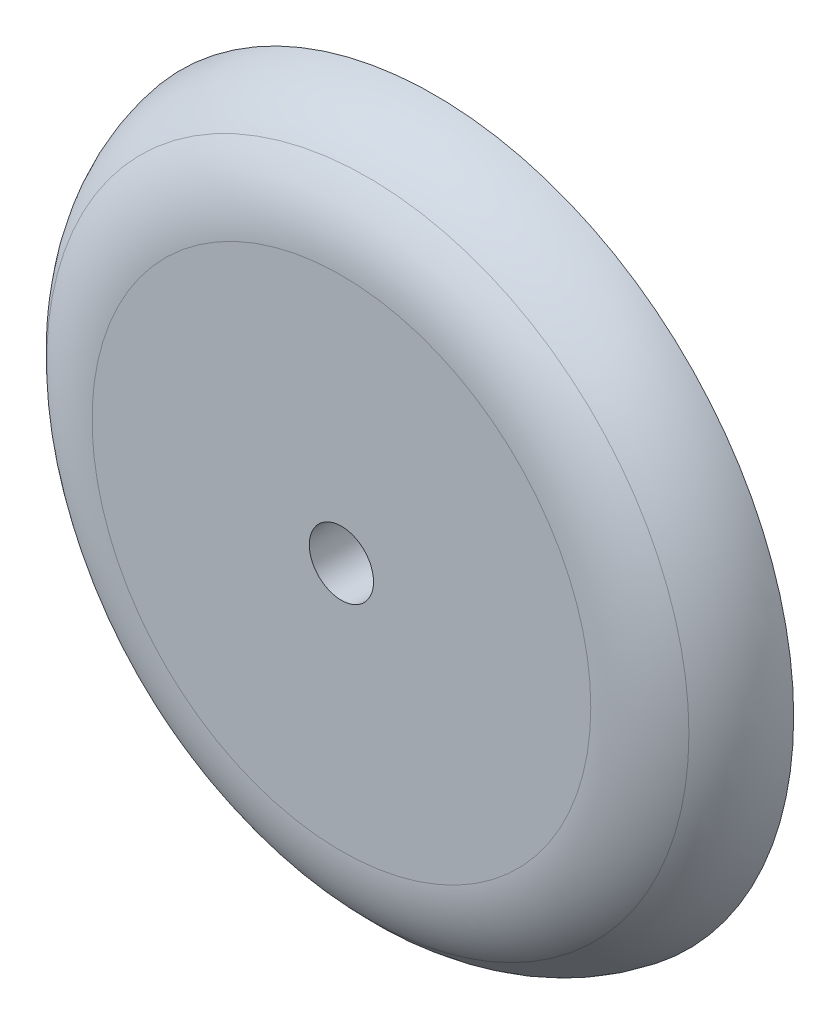
ISO-10303-21;
HEADER;
FILE_DESCRIPTION(('STEP AP214'),'2;1');
FILE_NAME('part.step','',(''),(''),'','','');
FILE_SCHEMA(('AUTOMOTIVE_DESIGN { 1 0 10303 214 1 1 1 1 }'));
ENDSEC;
DATA;
#1=APPLICATION_CONTEXT('core data for automotive mechanical design processes');
#2=APPLICATION_PROTOCOL_DEFINITION('international standard','automotive_design',2000,#1);
#3=PRODUCT_CONTEXT('',#1,'mechanical');
#4=PRODUCT('Part','Part','',(#3));
#5=PRODUCT_RELATED_PRODUCT_CATEGORY('part','',(#4));
#6=PRODUCT_DEFINITION_FORMATION('','',#4);
#7=PRODUCT_DEFINITION_CONTEXT('part definition',#1,'design');
#8=PRODUCT_DEFINITION('design','',#6,#7);
#9=PRODUCT_DEFINITION_SHAPE('','',#8);
#10=(LENGTH_UNIT() NAMED_UNIT(*) SI_UNIT(.MILLI.,.METRE.));
#11=(NAMED_UNIT(*) PLANE_ANGLE_UNIT() SI_UNIT($,.RADIAN.));
#12=(NAMED_UNIT(*) SI_UNIT($,.STERADIAN.) SOLID_ANGLE_UNIT());
#13=UNCERTAINTY_MEASURE_WITH_UNIT(LENGTH_MEASURE(1.E-05),#10,'distance_accuracy_value','');
#14=(GEOMETRIC_REPRESENTATION_CONTEXT(3) GLOBAL_UNCERTAINTY_ASSIGNED_CONTEXT((#13)) GLOBAL_UNIT_ASSIGNED_CONTEXT((#10,
#11,#12)) REPRESENTATION_CONTEXT('',''));
#15=CARTESIAN_POINT('',(0.,0.,0.));
#16=DIRECTION('',(0.,0.,1.));
#17=DIRECTION('',(1.,0.,0.));
#18=AXIS2_PLACEMENT_3D('',#15,#16,#17);
#19=CARTESIAN_POINT('',(0.,0.,-4.64792436389289));
#20=DIRECTION('',(0.,0.,1.));
#21=DIRECTION('',(1.,0.,0.));
#22=AXIS2_PLACEMENT_3D('',#19,#20,#21);
#23=TOROIDAL_SURFACE('',#22,66.0357397578838,29.3348184290529);
#24=CARTESIAN_POINT('',(0.,0.,17.7326119508336));
#25=DIRECTION('',(0.,0.,1.));
#26=DIRECTION('',(1.,0.,0.));
#27=AXIS2_PLACEMENT_3D('',#24,#25,#26);
#28=CIRCLE('',#27,85.);
#29=CARTESIAN_POINT('',(85.,0.,17.7326119508336));
#30=VERTEX_POINT('',#29);
#31=EDGE_CURVE('E10',#30,#30,#28,.T.);
#32=ORIENTED_EDGE('',*,*,#31,.F.);
#33=EDGE_LOOP('',(#32));
#34=FACE_BOUND('',#33,.T.);
#35=CARTESIAN_POINT('',(0.,0.,0.));
#36=DIRECTION('',(0.,0.,1.));
#37=DIRECTION('',(1.,0.,0.));
#38=AXIS2_PLACEMENT_3D('',#35,#36,#37);
#39=CIRCLE('',#38,95.);
#40=CARTESIAN_POINT('',(95.,0.,0.));
#41=VERTEX_POINT('',#40);
#42=EDGE_CURVE('E61',#41,#41,#39,.T.);
#43=ORIENTED_EDGE('',*,*,#42,.T.);
#44=EDGE_LOOP('',(#43));
#45=FACE_BOUND('',#44,.T.);
#46=ADVANCED_FACE('F40',(#34,#45),#23,.T.);
#47=CARTESIAN_POINT('',(0.,0.,-4.69010238396781));
#48=DIRECTION('',(0.,0.,1.));
#49=DIRECTION('',(1.,0.,0.));
#50=AXIS2_PLACEMENT_3D('',#47,#48,#49);
#51=TOROIDAL_SURFACE('',#50,66.,29.3901023839678);
#52=CARTESIAN_POINT('',(0.,0.,24.7));
#53=DIRECTION('',(0.,0.,1.));
#54=DIRECTION('',(1.,0.,0.));
#55=AXIS2_PLACEMENT_3D('',#52,#53,#54);
#56=CIRCLE('',#55,66.);
#57=CARTESIAN_POINT('',(66.,0.,24.7));
#58=VERTEX_POINT('',#57);
#59=EDGE_CURVE('E47',#58,#58,#56,.T.);
#60=ORIENTED_EDGE('',*,*,#59,.F.);
#61=EDGE_LOOP('',(#60));
#62=FACE_BOUND('',#61,.T.);
#63=ORIENTED_EDGE('',*,*,#31,.T.);
#64=EDGE_LOOP('',(#63));
#65=FACE_BOUND('',#64,.T.);
#66=ADVANCED_FACE('F110',(#62,#65),#51,.T.);
#67=CARTESIAN_POINT('',(0.,66.,24.7));
#68=DIRECTION('',(0.,0.,-1.));
#69=DIRECTION('',(-1.,0.,0.));
#70=AXIS2_PLACEMENT_3D('',#67,#68,#69);
#71=PLANE('',#70);
#72=CARTESIAN_POINT('',(0.,0.,24.7));
#73=DIRECTION('',(0.,0.,1.));
#74=DIRECTION('',(1.,0.,0.));
#75=AXIS2_PLACEMENT_3D('',#72,#73,#74);
#76=CIRCLE('',#75,8.5);
#77=CARTESIAN_POINT('',(8.5,0.,24.7));
#78=VERTEX_POINT('',#77);
#79=EDGE_CURVE('E52',#78,#78,#76,.T.);
#80=ORIENTED_EDGE('',*,*,#79,.F.);
#81=EDGE_LOOP('',(#80));
#82=FACE_BOUND('',#81,.T.);
#83=ORIENTED_EDGE('',*,*,#59,.T.);
#84=EDGE_LOOP('',(#83));
#85=FACE_BOUND('',#84,.T.);
#86=ADVANCED_FACE('F107',(#82,#85),#71,.F.);
#87=CARTESIAN_POINT('',(0.,0.,15.3879310344828));
#88=DIRECTION('',(0.,0.,1.));
#89=DIRECTION('',(1.,0.,0.));
#90=AXIS2_PLACEMENT_3D('',#87,#88,#89);
#91=CYLINDRICAL_SURFACE('',#90,8.5);
#92=CARTESIAN_POINT('',(0.,0.,0.));
#93=DIRECTION('',(0.,0.,1.));
#94=DIRECTION('',(1.,0.,0.));
#95=AXIS2_PLACEMENT_3D('',#92,#93,#94);
#96=CIRCLE('',#95,8.5);
#97=CARTESIAN_POINT('',(8.5,0.,0.));
#98=VERTEX_POINT('',#97);
#99=EDGE_CURVE('E56',#98,#98,#96,.T.);
#100=ORIENTED_EDGE('',*,*,#99,.F.);
#101=EDGE_LOOP('',(#100));
#102=FACE_BOUND('',#101,.T.);
#103=ORIENTED_EDGE('',*,*,#79,.T.);
#104=EDGE_LOOP('',(#103));
#105=FACE_BOUND('',#104,.T.);
#106=ADVANCED_FACE('F103',(#102,#105),#91,.F.);
#107=CARTESIAN_POINT('',(0.,8.5,0.));
#108=DIRECTION('',(0.,0.,1.));
#109=DIRECTION('',(1.,0.,0.));
#110=AXIS2_PLACEMENT_3D('',#107,#108,#109);
#111=PLANE('',#110);
#112=ORIENTED_EDGE('',*,*,#42,.F.);
#113=EDGE_LOOP('',(#112));
#114=FACE_BOUND('',#113,.T.);
#115=ORIENTED_EDGE('',*,*,#99,.T.);
#116=EDGE_LOOP('',(#115));
#117=FACE_BOUND('',#116,.T.);
#118=ADVANCED_FACE('F101',(#114,#117),#111,.F.);
#119=CLOSED_SHELL('',(#46,#66,#86,#106,#118));
#120=CARTESIAN_POINT('',(0.,0.,15.3879310344828));
#121=DIRECTION('',(0.,0.,1.));
#122=DIRECTION('',(1.,0.,0.));
#123=AXIS2_PLACEMENT_3D('',#120,#121,#122);
#124=CYLINDRICAL_SURFACE('',#123,80.2681139649835);
#125=CARTESIAN_POINT('',(0.,0.,15.1453112292184));
#126=DIRECTION('',(0.,0.,1.));
#127=DIRECTION('',(1.,0.,0.));
#128=AXIS2_PLACEMENT_3D('',#125,#126,#127);
#129=CIRCLE('',#128,80.2681139649835);
#130=CARTESIAN_POINT('',(80.2681139649835,0.,15.1453112292184));
#131=VERTEX_POINT('',#130);
#132=EDGE_CURVE('E73',#131,#131,#129,.T.);
#133=ORIENTED_EDGE('',*,*,#132,.T.);
#134=EDGE_LOOP('',(#133));
#135=FACE_BOUND('',#134,.T.);
#136=CARTESIAN_POINT('',(0.,0.,3.14531122921835));
#137=DIRECTION('',(0.,0.,1.));
#138=DIRECTION('',(1.,0.,0.));
#139=AXIS2_PLACEMENT_3D('',#136,#137,#138);
#140=CIRCLE('',#139,80.2681139649835);
#141=CARTESIAN_POINT('',(80.2681139649835,0.,3.14531122921835));
#142=VERTEX_POINT('',#141);
#143=EDGE_CURVE('E64',#142,#142,#140,.T.);
#144=ORIENTED_EDGE('',*,*,#143,.F.);
#145=EDGE_LOOP('',(#144));
#146=FACE_BOUND('',#145,.T.);
#147=ADVANCED_FACE('F77',(#135,#146),#124,.F.);
#148=CARTESIAN_POINT('',(0.,80.2681139649835,3.14531122921835));
#149=DIRECTION('',(0.,0.,1.));
#150=DIRECTION('',(1.,0.,0.));
#151=AXIS2_PLACEMENT_3D('',#148,#149,#150);
#152=PLANE('',#151);
#153=ORIENTED_EDGE('',*,*,#143,.T.);
#154=EDGE_LOOP('',(#153));
#155=FACE_BOUND('',#154,.T.);
#156=CARTESIAN_POINT('',(0.,0.,3.14531122921835));
#157=DIRECTION('',(0.,0.,1.));
#158=DIRECTION('',(1.,0.,0.));
#159=AXIS2_PLACEMENT_3D('',#156,#157,#158);
#160=CIRCLE('',#159,26.5771535692281);
#161=CARTESIAN_POINT('',(26.5771535692281,0.,3.14531122921835));
#162=VERTEX_POINT('',#161);
#163=EDGE_CURVE('E67',#162,#162,#160,.T.);
#164=ORIENTED_EDGE('',*,*,#163,.F.);
#165=EDGE_LOOP('',(#164));
#166=FACE_BOUND('',#165,.T.);
#167=ADVANCED_FACE('F89',(#155,#166),#152,.T.);
#168=CARTESIAN_POINT('',(0.,0.,15.3879310344828));
#169=DIRECTION('',(0.,0.,1.));
#170=DIRECTION('',(1.,0.,0.));
#171=AXIS2_PLACEMENT_3D('',#168,#169,#170);
#172=CYLINDRICAL_SURFACE('',#171,26.5771535692281);
#173=ORIENTED_EDGE('',*,*,#163,.T.);
#174=EDGE_LOOP('',(#173));
#175=FACE_BOUND('',#174,.T.);
#176=CARTESIAN_POINT('',(0.,0.,15.1453112292183));
#177=DIRECTION('',(0.,0.,1.));
#178=DIRECTION('',(1.,0.,0.));
#179=AXIS2_PLACEMENT_3D('',#176,#177,#178);
#180=CIRCLE('',#179,26.5771535692281);
#181=CARTESIAN_POINT('',(26.5771535692281,0.,15.1453112292183));
#182=VERTEX_POINT('',#181);
#183=EDGE_CURVE('E70',#182,#182,#180,.T.);
#184=ORIENTED_EDGE('',*,*,#183,.F.);
#185=EDGE_LOOP('',(#184));
#186=FACE_BOUND('',#185,.T.);
#187=ADVANCED_FACE('F82',(#175,#186),#172,.T.);
#188=CARTESIAN_POINT('',(0.,80.2681139649835,15.1453112292184));
#189=DIRECTION('',(0.,0.,-1.));
#190=DIRECTION('',(-1.,0.,0.));
#191=AXIS2_PLACEMENT_3D('',#188,#189,#190);
#192=PLANE('',#191);
#193=ORIENTED_EDGE('',*,*,#183,.T.);
#194=EDGE_LOOP('',(#193));
#195=FACE_BOUND('',#194,.T.);
#196=ORIENTED_EDGE('',*,*,#132,.F.);
#197=EDGE_LOOP('',(#196));
#198=FACE_BOUND('',#197,.T.);
#199=ADVANCED_FACE('F80',(#195,#198),#192,.T.);
#200=CLOSED_SHELL('',(#147,#167,#187,#199));
#201=ORIENTED_CLOSED_SHELL('',*,#200,.T.);
#202=BREP_WITH_VOIDS('B2',#119,(#201));
#203=ADVANCED_BREP_SHAPE_REPRESENTATION('',(#18,#202),#14);
#204=SHAPE_DEFINITION_REPRESENTATION(#9,#203);
ENDSEC;
END-ISO-10303-21;
